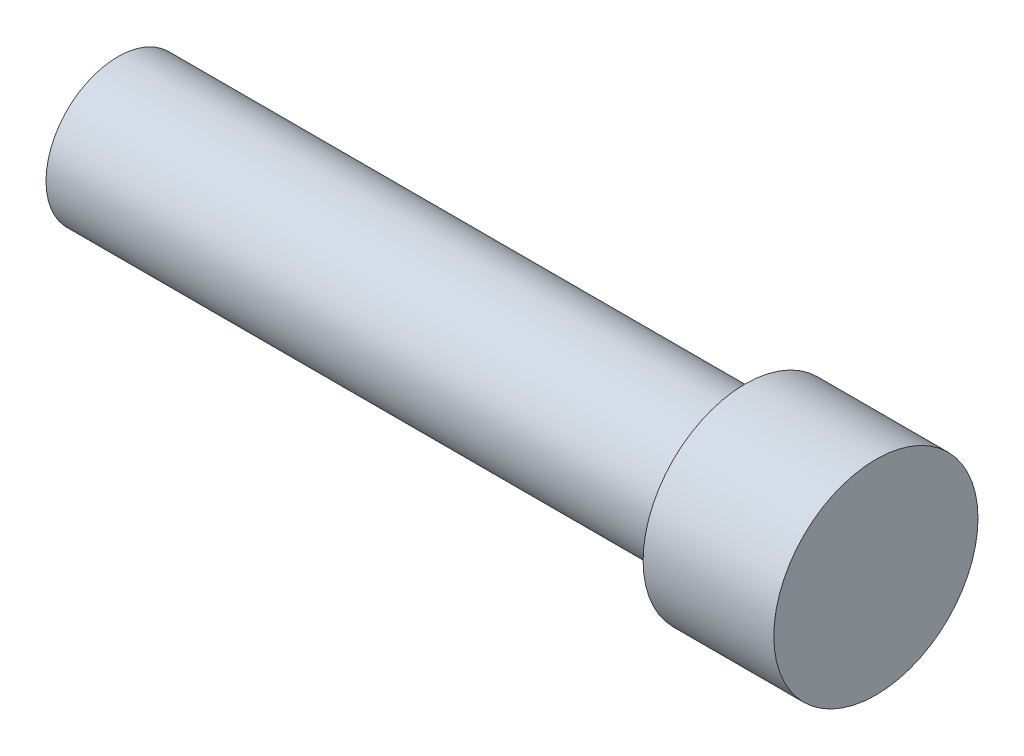
ISO-10303-21;
HEADER;
FILE_DESCRIPTION(('STEP AP214'),'2;1');
FILE_NAME('part.step','',(''),(''),'','','');
FILE_SCHEMA(('AUTOMOTIVE_DESIGN { 1 0 10303 214 1 1 1 1 }'));
ENDSEC;
DATA;
#1=APPLICATION_CONTEXT('core data for automotive mechanical design processes');
#2=APPLICATION_PROTOCOL_DEFINITION('international standard','automotive_design',2000,#1);
#3=PRODUCT_CONTEXT('',#1,'mechanical');
#4=PRODUCT('Part','Part','',(#3));
#5=PRODUCT_RELATED_PRODUCT_CATEGORY('part','',(#4));
#6=PRODUCT_DEFINITION_FORMATION('','',#4);
#7=PRODUCT_DEFINITION_CONTEXT('part definition',#1,'design');
#8=PRODUCT_DEFINITION('design','',#6,#7);
#9=PRODUCT_DEFINITION_SHAPE('','',#8);
#10=(LENGTH_UNIT() NAMED_UNIT(*) SI_UNIT(.MILLI.,.METRE.));
#11=(NAMED_UNIT(*) PLANE_ANGLE_UNIT() SI_UNIT($,.RADIAN.));
#12=(NAMED_UNIT(*) SI_UNIT($,.STERADIAN.) SOLID_ANGLE_UNIT());
#13=UNCERTAINTY_MEASURE_WITH_UNIT(LENGTH_MEASURE(1.E-05),#10,'distance_accuracy_value','');
#14=(GEOMETRIC_REPRESENTATION_CONTEXT(3) GLOBAL_UNCERTAINTY_ASSIGNED_CONTEXT((#13)) GLOBAL_UNIT_ASSIGNED_CONTEXT((#10,
#11,#12)) REPRESENTATION_CONTEXT('',''));
#15=CARTESIAN_POINT('',(0.,0.,0.));
#16=DIRECTION('',(0.,0.,1.));
#17=DIRECTION('',(1.,0.,0.));
#18=AXIS2_PLACEMENT_3D('',#15,#16,#17);
#19=CARTESIAN_POINT('',(7.62,0.,0.));
#20=DIRECTION('',(-1.,0.,0.));
#21=DIRECTION('',(0.,0.,1.));
#22=AXIS2_PLACEMENT_3D('',#19,#20,#21);
#23=CYLINDRICAL_SURFACE('',#22,5.953125);
#24=CARTESIAN_POINT('',(7.62,0.,0.));
#25=DIRECTION('',(1.,0.,0.));
#26=DIRECTION('',(0.,0.,-1.));
#27=AXIS2_PLACEMENT_3D('',#24,#25,#26);
#28=CIRCLE('',#27,5.953125);
#29=CARTESIAN_POINT('',(7.62,0.,5.953125));
#30=VERTEX_POINT('',#29);
#31=EDGE_CURVE('E46',#30,#30,#28,.T.);
#32=CARTESIAN_POINT('',(0.,0.,0.));
#33=DIRECTION('',(1.,0.,0.));
#34=DIRECTION('',(0.,0.,-1.));
#35=AXIS2_PLACEMENT_3D('',#32,#33,#34);
#36=CIRCLE('',#35,5.953125);
#37=CARTESIAN_POINT('',(0.,0.,5.953125));
#38=VERTEX_POINT('',#37);
#39=EDGE_CURVE('E42',#38,#38,#36,.T.);
#40=CARTESIAN_POINT('',(7.62,0.,5.953125));
#41=CARTESIAN_POINT('',(7.540625,0.,5.953125));
#42=CARTESIAN_POINT('',(7.46125,0.,5.953125));
#43=CARTESIAN_POINT('',(7.3025,0.,5.953125));
#44=CARTESIAN_POINT('',(7.223125,0.,5.953125));
#45=CARTESIAN_POINT('',(7.064375,0.,5.953125));
#46=CARTESIAN_POINT('',(6.985,0.,5.953125));
#47=CARTESIAN_POINT('',(6.82625,0.,5.953125));
#48=CARTESIAN_POINT('',(6.746875,0.,5.953125));
#49=CARTESIAN_POINT('',(6.588125,0.,5.953125));
#50=CARTESIAN_POINT('',(6.50875,0.,5.953125));
#51=CARTESIAN_POINT('',(6.35,0.,5.953125));
#52=CARTESIAN_POINT('',(6.270625,0.,5.953125));
#53=CARTESIAN_POINT('',(6.111875,0.,5.953125));
#54=CARTESIAN_POINT('',(6.0325,0.,5.953125));
#55=CARTESIAN_POINT('',(5.87375,0.,5.953125));
#56=CARTESIAN_POINT('',(5.794375,0.,5.953125));
#57=CARTESIAN_POINT('',(5.635625,0.,5.953125));
#58=CARTESIAN_POINT('',(5.55625,0.,5.953125));
#59=CARTESIAN_POINT('',(5.3975,0.,5.953125));
#60=CARTESIAN_POINT('',(5.318125,0.,5.953125));
#61=CARTESIAN_POINT('',(5.159375,0.,5.953125));
#62=CARTESIAN_POINT('',(5.08,0.,5.953125));
#63=CARTESIAN_POINT('',(4.92125,0.,5.953125));
#64=CARTESIAN_POINT('',(4.841875,0.,5.953125));
#65=CARTESIAN_POINT('',(4.683125,0.,5.953125));
#66=CARTESIAN_POINT('',(4.60375,0.,5.953125));
#67=CARTESIAN_POINT('',(4.445,0.,5.953125));
#68=CARTESIAN_POINT('',(4.365625,0.,5.953125));
#69=CARTESIAN_POINT('',(4.206875,0.,5.953125));
#70=CARTESIAN_POINT('',(4.1275,0.,5.953125));
#71=CARTESIAN_POINT('',(3.96875,0.,5.953125));
#72=CARTESIAN_POINT('',(3.889375,0.,5.953125));
#73=CARTESIAN_POINT('',(3.730625,0.,5.953125));
#74=CARTESIAN_POINT('',(3.65125,0.,5.953125));
#75=CARTESIAN_POINT('',(3.4925,0.,5.953125));
#76=CARTESIAN_POINT('',(3.413125,0.,5.953125));
#77=CARTESIAN_POINT('',(3.254375,0.,5.953125));
#78=CARTESIAN_POINT('',(3.175,0.,5.953125));
#79=CARTESIAN_POINT('',(3.01625,0.,5.953125));
#80=CARTESIAN_POINT('',(2.936875,0.,5.953125));
#81=CARTESIAN_POINT('',(2.778125,0.,5.953125));
#82=CARTESIAN_POINT('',(2.69875,0.,5.953125));
#83=CARTESIAN_POINT('',(2.54,0.,5.953125));
#84=CARTESIAN_POINT('',(2.460625,0.,5.953125));
#85=CARTESIAN_POINT('',(2.301875,0.,5.953125));
#86=CARTESIAN_POINT('',(2.2225,0.,5.953125));
#87=CARTESIAN_POINT('',(2.06375,0.,5.953125));
#88=CARTESIAN_POINT('',(1.984375,0.,5.953125));
#89=CARTESIAN_POINT('',(1.825625,0.,5.953125));
#90=CARTESIAN_POINT('',(1.74625,0.,5.953125));
#91=CARTESIAN_POINT('',(1.5875,0.,5.953125));
#92=CARTESIAN_POINT('',(1.508125,0.,5.953125));
#93=CARTESIAN_POINT('',(1.349375,0.,5.953125));
#94=CARTESIAN_POINT('',(1.27,0.,5.953125));
#95=CARTESIAN_POINT('',(1.11125,0.,5.953125));
#96=CARTESIAN_POINT('',(1.031875,0.,5.953125));
#97=CARTESIAN_POINT('',(0.873125,0.,5.953125));
#98=CARTESIAN_POINT('',(0.79375,0.,5.953125));
#99=CARTESIAN_POINT('',(0.635,0.,5.953125));
#100=CARTESIAN_POINT('',(0.555625,0.,5.953125));
#101=CARTESIAN_POINT('',(0.396875,0.,5.953125));
#102=CARTESIAN_POINT('',(0.3175,0.,5.953125));
#103=CARTESIAN_POINT('',(0.15875,0.,5.953125));
#104=CARTESIAN_POINT('',(0.0793749999999999,0.,5.953125));
#105=CARTESIAN_POINT('',(0.,0.,5.953125));
#106=B_SPLINE_CURVE_WITH_KNOTS('',3,(#40,#41,#42,#43,#44,#45,#46,#47,#48,#49,#50,#51,#52,#53,
#54,#55,#56,#57,#58,#59,#60,#61,#62,#63,#64,#65,#66,#67,#68,#69,#70,#71,#72,#73,#74,#75,#76,#77,
#78,#79,#80,#81,#82,#83,#84,#85,#86,#87,#88,#89,#90,#91,#92,#93,#94,#95,#96,#97,#98,#99,#100,
#101,#102,#103,#104,#105),.UNSPECIFIED.,.F.,.F.,(4,2,2,2,2,2,2,2,2,2,2,2,2,2,2,2,2,2,2,2,2,2,2,
2,2,2,2,2,2,2,2,2,4),(0.,0.238125,0.47625,0.714375000000001,0.9525,1.190625,1.42875,1.666875,
1.905,2.143125,2.38125,2.619375,2.8575,3.095625,3.33375,3.571875,3.81,4.048125,4.28625,4.524375,
4.7625,5.000625,5.23875,5.476875,5.715,5.953125,6.19125,6.429375,6.6675,6.905625,7.14375,
7.381875,7.62),.UNSPECIFIED.);
#107=EDGE_CURVE('BSEAM39',#30,#38,#106,.T.);
#108=ORIENTED_EDGE('',*,*,#31,.F.);
#109=ORIENTED_EDGE('',*,*,#39,.T.);
#110=ORIENTED_EDGE('',*,*,#107,.T.);
#111=ORIENTED_EDGE('',*,*,#107,.F.);
#112=EDGE_LOOP('',(#108,#110,#109,#111));
#113=FACE_BOUND('',#112,.T.);
#114=ADVANCED_FACE('F39',(#113),#23,.T.);
#115=CARTESIAN_POINT('',(7.62,0.,0.));
#116=DIRECTION('',(1.,0.,0.));
#117=DIRECTION('',(0.,0.,-1.));
#118=AXIS2_PLACEMENT_3D('',#115,#116,#117);
#119=PLANE('',#118);
#120=ORIENTED_EDGE('',*,*,#31,.T.);
#121=EDGE_LOOP('',(#120));
#122=FACE_BOUND('',#121,.T.);
#123=ADVANCED_FACE('F63',(#122),#119,.T.);
#124=CARTESIAN_POINT('',(0.,0.,0.));
#125=DIRECTION('',(1.,0.,0.));
#126=DIRECTION('',(0.,0.,-1.));
#127=AXIS2_PLACEMENT_3D('',#124,#125,#126);
#128=PLANE('',#127);
#129=CARTESIAN_POINT('',(0.,0.,0.));
#130=DIRECTION('',(-1.,0.,0.));
#131=DIRECTION('',(0.,0.,1.));
#132=AXIS2_PLACEMENT_3D('',#129,#130,#131);
#133=CIRCLE('',#132,4.191);
#134=CARTESIAN_POINT('',(0.,0.,4.191));
#135=VERTEX_POINT('',#134);
#136=EDGE_CURVE('E10',#135,#135,#133,.T.);
#137=ORIENTED_EDGE('',*,*,#136,.F.);
#138=EDGE_LOOP('',(#137));
#139=FACE_BOUND('',#138,.T.);
#140=ORIENTED_EDGE('',*,*,#39,.F.);
#141=EDGE_LOOP('',(#140));
#142=FACE_BOUND('',#141,.T.);
#143=ADVANCED_FACE('F60',(#139,#142),#128,.F.);
#144=CARTESIAN_POINT('',(-36.576,0.,0.));
#145=DIRECTION('',(1.,0.,0.));
#146=DIRECTION('',(0.,0.,-1.));
#147=AXIS2_PLACEMENT_3D('',#144,#145,#146);
#148=CYLINDRICAL_SURFACE('',#147,4.191);
#149=CARTESIAN_POINT('',(-36.576,0.,0.));
#150=DIRECTION('',(-1.,0.,0.));
#151=DIRECTION('',(0.,0.,1.));
#152=AXIS2_PLACEMENT_3D('',#149,#150,#151);
#153=CIRCLE('',#152,4.191);
#154=CARTESIAN_POINT('',(-36.576,0.,4.191));
#155=VERTEX_POINT('',#154);
#156=EDGE_CURVE('E52',#155,#155,#153,.T.);
#157=ORIENTED_EDGE('',*,*,#156,.F.);
#158=EDGE_LOOP('',(#157));
#159=FACE_BOUND('',#158,.T.);
#160=ORIENTED_EDGE('',*,*,#136,.T.);
#161=EDGE_LOOP('',(#160));
#162=FACE_BOUND('',#161,.T.);
#163=ADVANCED_FACE('F62',(#159,#162),#148,.T.);
#164=CARTESIAN_POINT('',(-36.576,0.,0.));
#165=DIRECTION('',(-1.,0.,0.));
#166=DIRECTION('',(0.,0.,1.));
#167=AXIS2_PLACEMENT_3D('',#164,#165,#166);
#168=PLANE('',#167);
#169=ORIENTED_EDGE('',*,*,#156,.T.);
#170=EDGE_LOOP('',(#169));
#171=FACE_BOUND('',#170,.T.);
#172=ADVANCED_FACE('F69',(#171),#168,.T.);
#173=CLOSED_SHELL('',(#114,#123,#143,#163,#172));
#174=MANIFOLD_SOLID_BREP('B2',#173);
#175=ADVANCED_BREP_SHAPE_REPRESENTATION('',(#18,#174),#14);
#176=SHAPE_DEFINITION_REPRESENTATION(#9,#175);
ENDSEC;
END-ISO-10303-21;
